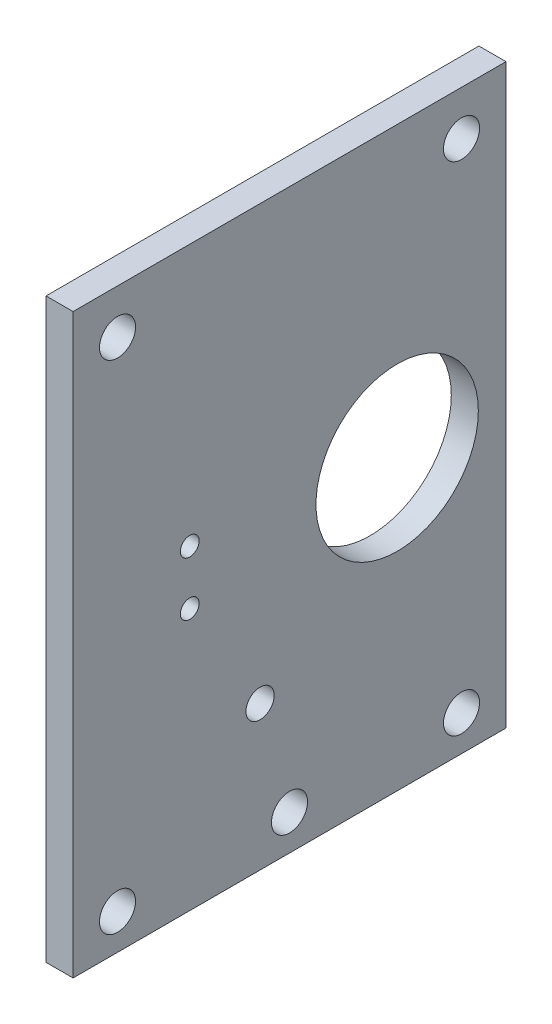
ISO-10303-21;
HEADER;
FILE_DESCRIPTION(('STEP AP214'),'2;1');
FILE_NAME('part.step','',(''),(''),'','','');
FILE_SCHEMA(('AUTOMOTIVE_DESIGN { 1 0 10303 214 1 1 1 1 }'));
ENDSEC;
DATA;
#1=APPLICATION_CONTEXT('core data for automotive mechanical design processes');
#2=APPLICATION_PROTOCOL_DEFINITION('international standard','automotive_design',2000,#1);
#3=PRODUCT_CONTEXT('',#1,'mechanical');
#4=PRODUCT('Part','Part','',(#3));
#5=PRODUCT_RELATED_PRODUCT_CATEGORY('part','',(#4));
#6=PRODUCT_DEFINITION_FORMATION('','',#4);
#7=PRODUCT_DEFINITION_CONTEXT('part definition',#1,'design');
#8=PRODUCT_DEFINITION('design','',#6,#7);
#9=PRODUCT_DEFINITION_SHAPE('','',#8);
#10=(LENGTH_UNIT() NAMED_UNIT(*) SI_UNIT(.MILLI.,.METRE.));
#11=(NAMED_UNIT(*) PLANE_ANGLE_UNIT() SI_UNIT($,.RADIAN.));
#12=(NAMED_UNIT(*) SI_UNIT($,.STERADIAN.) SOLID_ANGLE_UNIT());
#13=UNCERTAINTY_MEASURE_WITH_UNIT(LENGTH_MEASURE(1.E-05),#10,'distance_accuracy_value','');
#14=(GEOMETRIC_REPRESENTATION_CONTEXT(3) GLOBAL_UNCERTAINTY_ASSIGNED_CONTEXT((#13)) GLOBAL_UNIT_ASSIGNED_CONTEXT((#10,
#11,#12)) REPRESENTATION_CONTEXT('',''));
#15=CARTESIAN_POINT('',(0.,0.,0.));
#16=DIRECTION('',(0.,0.,1.));
#17=DIRECTION('',(1.,0.,0.));
#18=AXIS2_PLACEMENT_3D('',#15,#16,#17);
#19=CARTESIAN_POINT('',(4.7625,-50.8,-38.1));
#20=DIRECTION('',(0.,0.,1.));
#21=DIRECTION('',(1.,0.,0.));
#22=AXIS2_PLACEMENT_3D('',#19,#20,#21);
#23=PLANE('',#22);
#24=DIRECTION('',(0.,1.,0.));
#25=VECTOR('',#24,1.);
#26=CARTESIAN_POINT('',(0.,-50.8,-38.1));
#27=LINE('',#26,#25);
#28=CARTESIAN_POINT('',(0.,-50.8,-38.1));
#29=VERTEX_POINT('',#28);
#30=CARTESIAN_POINT('',(0.,50.8,-38.1));
#31=VERTEX_POINT('',#30);
#32=EDGE_CURVE('E99',#29,#31,#27,.T.);
#33=ORIENTED_EDGE('',*,*,#32,.T.);
#34=DIRECTION('',(-1.,0.,0.));
#35=VECTOR('',#34,1.);
#36=CARTESIAN_POINT('',(4.7625,50.8,-38.1));
#37=LINE('',#36,#35);
#38=CARTESIAN_POINT('',(4.7625,50.8,-38.1));
#39=VERTEX_POINT('',#38);
#40=EDGE_CURVE('E11',#39,#31,#37,.T.);
#41=ORIENTED_EDGE('',*,*,#40,.F.);
#42=DIRECTION('',(0.,1.,0.));
#43=VECTOR('',#42,1.);
#44=CARTESIAN_POINT('',(4.7625,-50.8,-38.1));
#45=LINE('',#44,#43);
#46=CARTESIAN_POINT('',(4.7625,-50.8,-38.1));
#47=VERTEX_POINT('',#46);
#48=EDGE_CURVE('E86',#47,#39,#45,.T.);
#49=ORIENTED_EDGE('',*,*,#48,.F.);
#50=DIRECTION('',(-1.,0.,0.));
#51=VECTOR('',#50,1.);
#52=CARTESIAN_POINT('',(4.7625,-50.8,-38.1));
#53=LINE('',#52,#51);
#54=EDGE_CURVE('E95',#47,#29,#53,.T.);
#55=ORIENTED_EDGE('',*,*,#54,.T.);
#56=EDGE_LOOP('',(#33,#41,#49,#55));
#57=FACE_BOUND('',#56,.T.);
#58=ADVANCED_FACE('F33',(#57),#23,.F.);
#59=CARTESIAN_POINT('',(4.7625,50.8,38.1));
#60=DIRECTION('',(0.,-1.,0.));
#61=DIRECTION('',(0.,0.,-1.));
#62=AXIS2_PLACEMENT_3D('',#59,#60,#61);
#63=PLANE('',#62);
#64=DIRECTION('',(0.,0.,1.));
#65=VECTOR('',#64,1.);
#66=CARTESIAN_POINT('',(0.,50.8,38.1));
#67=LINE('',#66,#65);
#68=CARTESIAN_POINT('',(0.,50.8,38.1));
#69=VERTEX_POINT('',#68);
#70=EDGE_CURVE('E90',#31,#69,#67,.T.);
#71=ORIENTED_EDGE('',*,*,#70,.T.);
#72=DIRECTION('',(-1.,0.,0.));
#73=VECTOR('',#72,1.);
#74=CARTESIAN_POINT('',(4.7625,50.8,38.1));
#75=LINE('',#74,#73);
#76=CARTESIAN_POINT('',(4.7625,50.8,38.1));
#77=VERTEX_POINT('',#76);
#78=EDGE_CURVE('E42',#77,#69,#75,.T.);
#79=ORIENTED_EDGE('',*,*,#78,.F.);
#80=DIRECTION('',(0.,0.,1.));
#81=VECTOR('',#80,1.);
#82=CARTESIAN_POINT('',(4.7625,50.8,38.1));
#83=LINE('',#82,#81);
#84=EDGE_CURVE('E81',#39,#77,#83,.T.);
#85=ORIENTED_EDGE('',*,*,#84,.F.);
#86=ORIENTED_EDGE('',*,*,#40,.T.);
#87=EDGE_LOOP('',(#71,#79,#85,#86));
#88=FACE_BOUND('',#87,.T.);
#89=ADVANCED_FACE('F89',(#88),#63,.F.);
#90=CARTESIAN_POINT('',(4.7625,-50.8,38.1));
#91=DIRECTION('',(0.,0.,-1.));
#92=DIRECTION('',(-1.,0.,0.));
#93=AXIS2_PLACEMENT_3D('',#90,#91,#92);
#94=PLANE('',#93);
#95=DIRECTION('',(0.,-1.,0.));
#96=VECTOR('',#95,1.);
#97=CARTESIAN_POINT('',(0.,-50.8,38.1));
#98=LINE('',#97,#96);
#99=CARTESIAN_POINT('',(0.,-50.8,38.1));
#100=VERTEX_POINT('',#99);
#101=EDGE_CURVE('E68',#69,#100,#98,.T.);
#102=ORIENTED_EDGE('',*,*,#101,.T.);
#103=DIRECTION('',(-1.,0.,0.));
#104=VECTOR('',#103,1.);
#105=CARTESIAN_POINT('',(4.7625,-50.8,38.1));
#106=LINE('',#105,#104);
#107=CARTESIAN_POINT('',(4.7625,-50.8,38.1));
#108=VERTEX_POINT('',#107);
#109=EDGE_CURVE('E91',#108,#100,#106,.T.);
#110=ORIENTED_EDGE('',*,*,#109,.F.);
#111=DIRECTION('',(0.,-1.,0.));
#112=VECTOR('',#111,1.);
#113=CARTESIAN_POINT('',(4.7625,-50.8,38.1));
#114=LINE('',#113,#112);
#115=EDGE_CURVE('E84',#77,#108,#114,.T.);
#116=ORIENTED_EDGE('',*,*,#115,.F.);
#117=ORIENTED_EDGE('',*,*,#78,.T.);
#118=EDGE_LOOP('',(#102,#110,#116,#117));
#119=FACE_BOUND('',#118,.T.);
#120=ADVANCED_FACE('F93',(#119),#94,.F.);
#121=CARTESIAN_POINT('',(4.7625,-50.8,38.1));
#122=DIRECTION('',(0.,1.,0.));
#123=DIRECTION('',(0.,0.,1.));
#124=AXIS2_PLACEMENT_3D('',#121,#122,#123);
#125=PLANE('',#124);
#126=DIRECTION('',(0.,0.,-1.));
#127=VECTOR('',#126,1.);
#128=CARTESIAN_POINT('',(0.,-50.8,38.1));
#129=LINE('',#128,#127);
#130=EDGE_CURVE('E74',#100,#29,#129,.T.);
#131=ORIENTED_EDGE('',*,*,#130,.T.);
#132=ORIENTED_EDGE('',*,*,#54,.F.);
#133=DIRECTION('',(0.,0.,-1.));
#134=VECTOR('',#133,1.);
#135=CARTESIAN_POINT('',(4.7625,-50.8,38.1));
#136=LINE('',#135,#134);
#137=EDGE_CURVE('E51',#108,#47,#136,.T.);
#138=ORIENTED_EDGE('',*,*,#137,.F.);
#139=ORIENTED_EDGE('',*,*,#109,.T.);
#140=EDGE_LOOP('',(#131,#132,#138,#139));
#141=FACE_BOUND('',#140,.T.);
#142=ADVANCED_FACE('F155',(#141),#125,.F.);
#143=CARTESIAN_POINT('',(4.7625,0.,0.));
#144=DIRECTION('',(-1.,0.,0.));
#145=DIRECTION('',(0.,0.,1.));
#146=AXIS2_PLACEMENT_3D('',#143,#144,#145);
#147=PLANE('',#146);
#148=CARTESIAN_POINT('',(4.7625,-4.76250000000012,17.5641));
#149=DIRECTION('',(1.,0.,0.));
#150=DIRECTION('',(0.,0.,-1.));
#151=AXIS2_PLACEMENT_3D('',#148,#149,#150);
#152=CIRCLE('',#151,1.65);
#153=CARTESIAN_POINT('',(4.7625,-4.76250000000012,15.9141));
#154=VERTEX_POINT('',#153);
#155=EDGE_CURVE('E286',#154,#154,#152,.T.);
#156=ORIENTED_EDGE('',*,*,#155,.F.);
#157=EDGE_LOOP('',(#156));
#158=FACE_BOUND('',#157,.T.);
#159=CARTESIAN_POINT('',(4.7625,4.76249999999988,17.5641));
#160=DIRECTION('',(1.,0.,0.));
#161=DIRECTION('',(0.,0.,-1.));
#162=AXIS2_PLACEMENT_3D('',#159,#160,#161);
#163=CIRCLE('',#162,1.65);
#164=CARTESIAN_POINT('',(4.7625,4.76249999999988,15.9141));
#165=VERTEX_POINT('',#164);
#166=EDGE_CURVE('E290',#165,#165,#163,.T.);
#167=ORIENTED_EDGE('',*,*,#166,.F.);
#168=EDGE_LOOP('',(#167));
#169=FACE_BOUND('',#168,.T.);
#170=CARTESIAN_POINT('',(4.7625,-44.5643,0.));
#171=DIRECTION('',(1.,0.,0.));
#172=DIRECTION('',(0.,0.,-1.));
#173=AXIS2_PLACEMENT_3D('',#170,#171,#172);
#174=CIRCLE('',#173,3.175);
#175=CARTESIAN_POINT('',(4.7625,-44.5643,-3.175));
#176=VERTEX_POINT('',#175);
#177=EDGE_CURVE('E138',#176,#176,#174,.T.);
#178=ORIENTED_EDGE('',*,*,#177,.F.);
#179=EDGE_LOOP('',(#178));
#180=FACE_BOUND('',#179,.T.);
#181=CARTESIAN_POINT('',(4.7625,-25.4,5.1816));
#182=DIRECTION('',(1.,0.,0.));
#183=DIRECTION('',(0.,0.,-1.));
#184=AXIS2_PLACEMENT_3D('',#181,#182,#183);
#185=CIRCLE('',#184,2.4892);
#186=CARTESIAN_POINT('',(4.7625,-25.4,2.6924));
#187=VERTEX_POINT('',#186);
#188=EDGE_CURVE('E128',#187,#187,#185,.T.);
#189=ORIENTED_EDGE('',*,*,#188,.F.);
#190=EDGE_LOOP('',(#189));
#191=FACE_BOUND('',#190,.T.);
#192=CARTESIAN_POINT('',(4.7625,0.,-18.9484));
#193=DIRECTION('',(1.,0.,0.));
#194=DIRECTION('',(0.,0.,-1.));
#195=AXIS2_PLACEMENT_3D('',#192,#193,#194);
#196=CIRCLE('',#195,14.2875);
#197=CARTESIAN_POINT('',(4.7625,0.,-33.2359));
#198=VERTEX_POINT('',#197);
#199=EDGE_CURVE('E125',#198,#198,#196,.T.);
#200=ORIENTED_EDGE('',*,*,#199,.F.);
#201=EDGE_LOOP('',(#200));
#202=FACE_BOUND('',#201,.T.);
#203=CARTESIAN_POINT('',(4.7625,-44.5643,30.2768));
#204=DIRECTION('',(1.,0.,0.));
#205=DIRECTION('',(0.,0.,-1.));
#206=AXIS2_PLACEMENT_3D('',#203,#204,#205);
#207=CIRCLE('',#206,3.175);
#208=CARTESIAN_POINT('',(4.7625,-44.5643,27.1018));
#209=VERTEX_POINT('',#208);
#210=EDGE_CURVE('E122',#209,#209,#207,.T.);
#211=ORIENTED_EDGE('',*,*,#210,.F.);
#212=EDGE_LOOP('',(#211));
#213=FACE_BOUND('',#212,.T.);
#214=CARTESIAN_POINT('',(4.7625,42.9768,30.2768));
#215=DIRECTION('',(1.,0.,0.));
#216=DIRECTION('',(0.,0.,-1.));
#217=AXIS2_PLACEMENT_3D('',#214,#215,#216);
#218=CIRCLE('',#217,3.175);
#219=CARTESIAN_POINT('',(4.7625,42.9768,27.1018));
#220=VERTEX_POINT('',#219);
#221=EDGE_CURVE('E118',#220,#220,#218,.T.);
#222=ORIENTED_EDGE('',*,*,#221,.F.);
#223=EDGE_LOOP('',(#222));
#224=FACE_BOUND('',#223,.T.);
#225=CARTESIAN_POINT('',(4.7625,-44.5643,-30.2768));
#226=DIRECTION('',(1.,0.,0.));
#227=DIRECTION('',(0.,0.,-1.));
#228=AXIS2_PLACEMENT_3D('',#225,#226,#227);
#229=CIRCLE('',#228,3.17499999999999);
#230=CARTESIAN_POINT('',(4.7625,-44.5643,-33.4518));
#231=VERTEX_POINT('',#230);
#232=EDGE_CURVE('E114',#231,#231,#229,.T.);
#233=ORIENTED_EDGE('',*,*,#232,.F.);
#234=EDGE_LOOP('',(#233));
#235=FACE_BOUND('',#234,.T.);
#236=CARTESIAN_POINT('',(4.7625,42.9768,-30.2768));
#237=DIRECTION('',(1.,0.,0.));
#238=DIRECTION('',(0.,0.,-1.));
#239=AXIS2_PLACEMENT_3D('',#236,#237,#238);
#240=CIRCLE('',#239,3.175);
#241=CARTESIAN_POINT('',(4.7625,42.9768,-33.4518));
#242=VERTEX_POINT('',#241);
#243=EDGE_CURVE('E110',#242,#242,#240,.T.);
#244=ORIENTED_EDGE('',*,*,#243,.F.);
#245=EDGE_LOOP('',(#244));
#246=FACE_BOUND('',#245,.T.);
#247=ORIENTED_EDGE('',*,*,#48,.T.);
#248=ORIENTED_EDGE('',*,*,#84,.T.);
#249=ORIENTED_EDGE('',*,*,#115,.T.);
#250=ORIENTED_EDGE('',*,*,#137,.T.);
#251=EDGE_LOOP('',(#247,#248,#249,#250));
#252=FACE_BOUND('',#251,.T.);
#253=ADVANCED_FACE('F82',(#158,#169,#180,#191,#202,#213,#224,#235,#246,#252),#147,.F.);
#254=CARTESIAN_POINT('',(0.,0.,0.));
#255=DIRECTION('',(-1.,0.,0.));
#256=DIRECTION('',(0.,0.,1.));
#257=AXIS2_PLACEMENT_3D('',#254,#255,#256);
#258=PLANE('',#257);
#259=CARTESIAN_POINT('',(0.,-4.76250000000012,17.5641));
#260=DIRECTION('',(-1.,0.,0.));
#261=DIRECTION('',(0.,0.,1.));
#262=AXIS2_PLACEMENT_3D('',#259,#260,#261);
#263=CIRCLE('',#262,1.65);
#264=CARTESIAN_POINT('',(0.,-4.76250000000012,19.2141));
#265=VERTEX_POINT('',#264);
#266=EDGE_CURVE('E289',#265,#265,#263,.T.);
#267=ORIENTED_EDGE('',*,*,#266,.F.);
#268=EDGE_LOOP('',(#267));
#269=FACE_BOUND('',#268,.T.);
#270=CARTESIAN_POINT('',(0.,4.76249999999988,17.5641));
#271=DIRECTION('',(-1.,0.,0.));
#272=DIRECTION('',(0.,0.,1.));
#273=AXIS2_PLACEMENT_3D('',#270,#271,#272);
#274=CIRCLE('',#273,1.65);
#275=CARTESIAN_POINT('',(0.,4.76249999999988,19.2141));
#276=VERTEX_POINT('',#275);
#277=EDGE_CURVE('E293',#276,#276,#274,.T.);
#278=ORIENTED_EDGE('',*,*,#277,.F.);
#279=EDGE_LOOP('',(#278));
#280=FACE_BOUND('',#279,.T.);
#281=CARTESIAN_POINT('',(0.,-44.5643,0.));
#282=DIRECTION('',(-1.,0.,0.));
#283=DIRECTION('',(0.,0.,1.));
#284=AXIS2_PLACEMENT_3D('',#281,#282,#283);
#285=CIRCLE('',#284,3.175);
#286=CARTESIAN_POINT('',(0.,-44.5643,3.175));
#287=VERTEX_POINT('',#286);
#288=EDGE_CURVE('E36',#287,#287,#285,.T.);
#289=ORIENTED_EDGE('',*,*,#288,.F.);
#290=EDGE_LOOP('',(#289));
#291=FACE_BOUND('',#290,.T.);
#292=CARTESIAN_POINT('',(0.,-25.4,5.1816));
#293=DIRECTION('',(-1.,0.,0.));
#294=DIRECTION('',(0.,0.,1.));
#295=AXIS2_PLACEMENT_3D('',#292,#293,#294);
#296=CIRCLE('',#295,2.4892);
#297=CARTESIAN_POINT('',(0.,-25.4,7.6708));
#298=VERTEX_POINT('',#297);
#299=EDGE_CURVE('E126',#298,#298,#296,.T.);
#300=ORIENTED_EDGE('',*,*,#299,.F.);
#301=EDGE_LOOP('',(#300));
#302=FACE_BOUND('',#301,.T.);
#303=CARTESIAN_POINT('',(0.,0.,-18.9484));
#304=DIRECTION('',(-1.,0.,0.));
#305=DIRECTION('',(0.,0.,1.));
#306=AXIS2_PLACEMENT_3D('',#303,#304,#305);
#307=CIRCLE('',#306,14.2875);
#308=CARTESIAN_POINT('',(0.,0.,-4.66089999999999));
#309=VERTEX_POINT('',#308);
#310=EDGE_CURVE('E123',#309,#309,#307,.T.);
#311=ORIENTED_EDGE('',*,*,#310,.F.);
#312=EDGE_LOOP('',(#311));
#313=FACE_BOUND('',#312,.T.);
#314=CARTESIAN_POINT('',(0.,-44.5643,30.2768));
#315=DIRECTION('',(-1.,0.,0.));
#316=DIRECTION('',(0.,0.,1.));
#317=AXIS2_PLACEMENT_3D('',#314,#315,#316);
#318=CIRCLE('',#317,3.175);
#319=CARTESIAN_POINT('',(0.,-44.5643,33.4518));
#320=VERTEX_POINT('',#319);
#321=EDGE_CURVE('E119',#320,#320,#318,.T.);
#322=ORIENTED_EDGE('',*,*,#321,.F.);
#323=EDGE_LOOP('',(#322));
#324=FACE_BOUND('',#323,.T.);
#325=CARTESIAN_POINT('',(0.,42.9768,30.2768));
#326=DIRECTION('',(-1.,0.,0.));
#327=DIRECTION('',(0.,0.,1.));
#328=AXIS2_PLACEMENT_3D('',#325,#326,#327);
#329=CIRCLE('',#328,3.175);
#330=CARTESIAN_POINT('',(0.,42.9768,33.4518));
#331=VERTEX_POINT('',#330);
#332=EDGE_CURVE('E115',#331,#331,#329,.T.);
#333=ORIENTED_EDGE('',*,*,#332,.F.);
#334=EDGE_LOOP('',(#333));
#335=FACE_BOUND('',#334,.T.);
#336=CARTESIAN_POINT('',(0.,-44.5643,-30.2768));
#337=DIRECTION('',(-1.,0.,0.));
#338=DIRECTION('',(0.,0.,1.));
#339=AXIS2_PLACEMENT_3D('',#336,#337,#338);
#340=CIRCLE('',#339,3.17499999999999);
#341=CARTESIAN_POINT('',(0.,-44.5643,-27.1018));
#342=VERTEX_POINT('',#341);
#343=EDGE_CURVE('E111',#342,#342,#340,.T.);
#344=ORIENTED_EDGE('',*,*,#343,.F.);
#345=EDGE_LOOP('',(#344));
#346=FACE_BOUND('',#345,.T.);
#347=CARTESIAN_POINT('',(0.,42.9768,-30.2768));
#348=DIRECTION('',(-1.,0.,0.));
#349=DIRECTION('',(0.,0.,1.));
#350=AXIS2_PLACEMENT_3D('',#347,#348,#349);
#351=CIRCLE('',#350,3.175);
#352=CARTESIAN_POINT('',(0.,42.9768,-27.1018));
#353=VERTEX_POINT('',#352);
#354=EDGE_CURVE('E102',#353,#353,#351,.T.);
#355=ORIENTED_EDGE('',*,*,#354,.F.);
#356=EDGE_LOOP('',(#355));
#357=FACE_BOUND('',#356,.T.);
#358=ORIENTED_EDGE('',*,*,#32,.F.);
#359=ORIENTED_EDGE('',*,*,#130,.F.);
#360=ORIENTED_EDGE('',*,*,#101,.F.);
#361=ORIENTED_EDGE('',*,*,#70,.F.);
#362=EDGE_LOOP('',(#358,#359,#360,#361));
#363=FACE_BOUND('',#362,.T.);
#364=ADVANCED_FACE('F154',(#269,#280,#291,#302,#313,#324,#335,#346,#357,#363),#258,.T.);
#365=CARTESIAN_POINT('',(-1.5875,42.9768,-30.2768));
#366=DIRECTION('',(1.,0.,0.));
#367=DIRECTION('',(0.,0.,-1.));
#368=AXIS2_PLACEMENT_3D('',#365,#366,#367);
#369=CYLINDRICAL_SURFACE('',#368,3.175);
#370=ORIENTED_EDGE('',*,*,#354,.T.);
#371=EDGE_LOOP('',(#370));
#372=FACE_BOUND('',#371,.T.);
#373=ORIENTED_EDGE('',*,*,#243,.T.);
#374=EDGE_LOOP('',(#373));
#375=FACE_BOUND('',#374,.T.);
#376=ADVANCED_FACE('F151',(#372,#375),#369,.F.);
#377=CARTESIAN_POINT('',(-1.5875,-44.5643,-30.2768));
#378=DIRECTION('',(1.,0.,0.));
#379=DIRECTION('',(0.,0.,-1.));
#380=AXIS2_PLACEMENT_3D('',#377,#378,#379);
#381=CYLINDRICAL_SURFACE('',#380,3.17499999999999);
#382=ORIENTED_EDGE('',*,*,#343,.T.);
#383=EDGE_LOOP('',(#382));
#384=FACE_BOUND('',#383,.T.);
#385=ORIENTED_EDGE('',*,*,#232,.T.);
#386=EDGE_LOOP('',(#385));
#387=FACE_BOUND('',#386,.T.);
#388=ADVANCED_FACE('F204',(#384,#387),#381,.F.);
#389=CARTESIAN_POINT('',(-1.5875,42.9768,30.2768));
#390=DIRECTION('',(1.,0.,0.));
#391=DIRECTION('',(0.,0.,-1.));
#392=AXIS2_PLACEMENT_3D('',#389,#390,#391);
#393=CYLINDRICAL_SURFACE('',#392,3.175);
#394=ORIENTED_EDGE('',*,*,#332,.T.);
#395=EDGE_LOOP('',(#394));
#396=FACE_BOUND('',#395,.T.);
#397=ORIENTED_EDGE('',*,*,#221,.T.);
#398=EDGE_LOOP('',(#397));
#399=FACE_BOUND('',#398,.T.);
#400=ADVANCED_FACE('F210',(#396,#399),#393,.F.);
#401=CARTESIAN_POINT('',(-1.5875,-44.5643,30.2768));
#402=DIRECTION('',(1.,0.,0.));
#403=DIRECTION('',(0.,0.,-1.));
#404=AXIS2_PLACEMENT_3D('',#401,#402,#403);
#405=CYLINDRICAL_SURFACE('',#404,3.175);
#406=ORIENTED_EDGE('',*,*,#321,.T.);
#407=EDGE_LOOP('',(#406));
#408=FACE_BOUND('',#407,.T.);
#409=ORIENTED_EDGE('',*,*,#210,.T.);
#410=EDGE_LOOP('',(#409));
#411=FACE_BOUND('',#410,.T.);
#412=ADVANCED_FACE('F218',(#408,#411),#405,.F.);
#413=CARTESIAN_POINT('',(-1.5875,0.,-18.9484));
#414=DIRECTION('',(1.,0.,0.));
#415=DIRECTION('',(0.,0.,-1.));
#416=AXIS2_PLACEMENT_3D('',#413,#414,#415);
#417=CYLINDRICAL_SURFACE('',#416,14.2875);
#418=ORIENTED_EDGE('',*,*,#310,.T.);
#419=EDGE_LOOP('',(#418));
#420=FACE_BOUND('',#419,.T.);
#421=ORIENTED_EDGE('',*,*,#199,.T.);
#422=EDGE_LOOP('',(#421));
#423=FACE_BOUND('',#422,.T.);
#424=ADVANCED_FACE('F226',(#420,#423),#417,.F.);
#425=CARTESIAN_POINT('',(-1.5875,-25.4,5.1816));
#426=DIRECTION('',(1.,0.,0.));
#427=DIRECTION('',(0.,0.,-1.));
#428=AXIS2_PLACEMENT_3D('',#425,#426,#427);
#429=CYLINDRICAL_SURFACE('',#428,2.4892);
#430=ORIENTED_EDGE('',*,*,#299,.T.);
#431=EDGE_LOOP('',(#430));
#432=FACE_BOUND('',#431,.T.);
#433=ORIENTED_EDGE('',*,*,#188,.T.);
#434=EDGE_LOOP('',(#433));
#435=FACE_BOUND('',#434,.T.);
#436=ADVANCED_FACE('F234',(#432,#435),#429,.F.);
#437=CARTESIAN_POINT('',(-1.5875,-44.5643,0.));
#438=DIRECTION('',(1.,0.,0.));
#439=DIRECTION('',(0.,0.,-1.));
#440=AXIS2_PLACEMENT_3D('',#437,#438,#439);
#441=CYLINDRICAL_SURFACE('',#440,3.175);
#442=ORIENTED_EDGE('',*,*,#288,.T.);
#443=EDGE_LOOP('',(#442));
#444=FACE_BOUND('',#443,.T.);
#445=ORIENTED_EDGE('',*,*,#177,.T.);
#446=EDGE_LOOP('',(#445));
#447=FACE_BOUND('',#446,.T.);
#448=ADVANCED_FACE('F242',(#444,#447),#441,.F.);
#449=CARTESIAN_POINT('',(4.7625,4.76249999999988,17.5641));
#450=DIRECTION('',(1.,0.,0.));
#451=DIRECTION('',(0.,0.,-1.));
#452=AXIS2_PLACEMENT_3D('',#449,#450,#451);
#453=CYLINDRICAL_SURFACE('',#452,1.65);
#454=ORIENTED_EDGE('',*,*,#166,.T.);
#455=EDGE_LOOP('',(#454));
#456=FACE_BOUND('',#455,.T.);
#457=ORIENTED_EDGE('',*,*,#277,.T.);
#458=EDGE_LOOP('',(#457));
#459=FACE_BOUND('',#458,.T.);
#460=ADVANCED_FACE('F248',(#456,#459),#453,.F.);
#461=CARTESIAN_POINT('',(4.7625,-4.76250000000012,17.5641));
#462=DIRECTION('',(1.,0.,0.));
#463=DIRECTION('',(0.,0.,-1.));
#464=AXIS2_PLACEMENT_3D('',#461,#462,#463);
#465=CYLINDRICAL_SURFACE('',#464,1.65);
#466=ORIENTED_EDGE('',*,*,#155,.T.);
#467=EDGE_LOOP('',(#466));
#468=FACE_BOUND('',#467,.T.);
#469=ORIENTED_EDGE('',*,*,#266,.T.);
#470=EDGE_LOOP('',(#469));
#471=FACE_BOUND('',#470,.T.);
#472=ADVANCED_FACE('F255',(#468,#471),#465,.F.);
#473=CLOSED_SHELL('',(#58,#89,#120,#142,#253,#364,#376,#388,#400,#412,#424,#436,#448,#460,#472));
#474=MANIFOLD_SOLID_BREP('B2',#473);
#475=ADVANCED_BREP_SHAPE_REPRESENTATION('',(#18,#474),#14);
#476=SHAPE_DEFINITION_REPRESENTATION(#9,#475);
ENDSEC;
END-ISO-10303-21;
